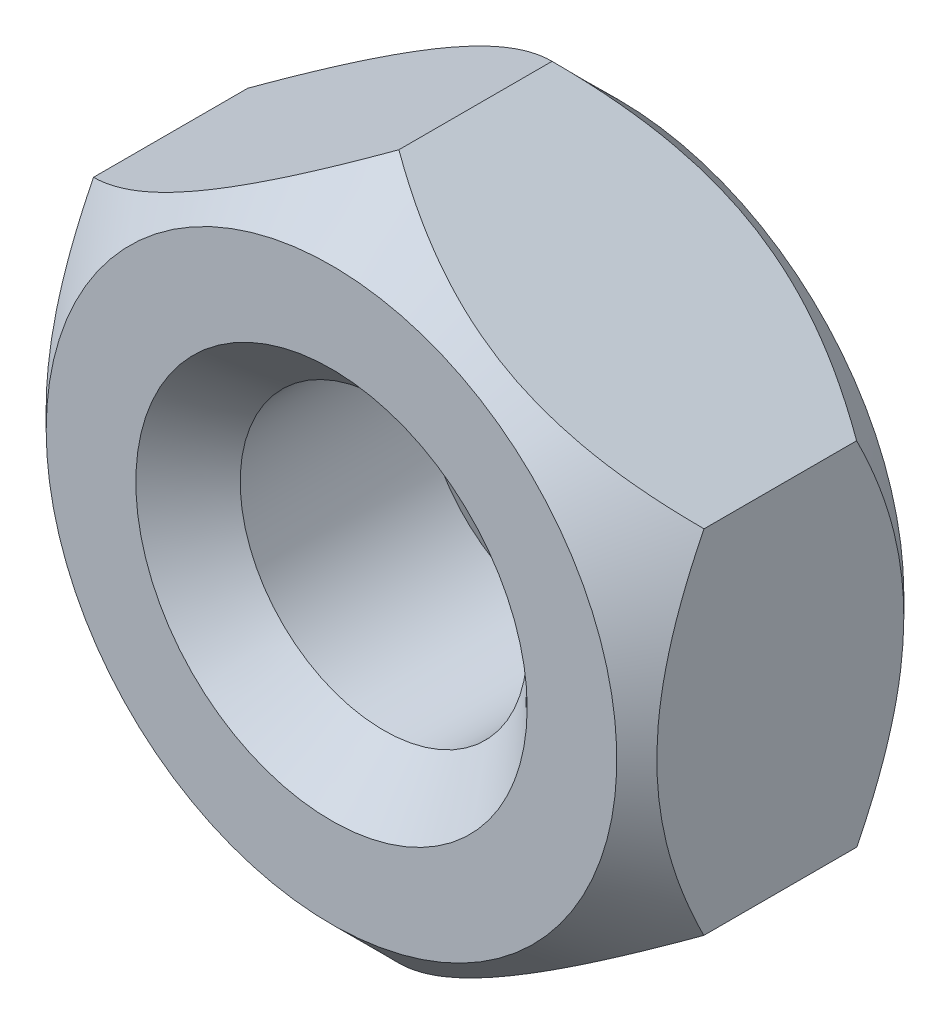
ISO-10303-21;
HEADER;
FILE_DESCRIPTION(('STEP AP214'),'2;1');
FILE_NAME('part.step','',(''),(''),'','','');
FILE_SCHEMA(('AUTOMOTIVE_DESIGN { 1 0 10303 214 1 1 1 1 }'));
ENDSEC;
DATA;
#1=APPLICATION_CONTEXT('core data for automotive mechanical design processes');
#2=APPLICATION_PROTOCOL_DEFINITION('international standard','automotive_design',2000,#1);
#3=PRODUCT_CONTEXT('',#1,'mechanical');
#4=PRODUCT('Part','Part','',(#3));
#5=PRODUCT_RELATED_PRODUCT_CATEGORY('part','',(#4));
#6=PRODUCT_DEFINITION_FORMATION('','',#4);
#7=PRODUCT_DEFINITION_CONTEXT('part definition',#1,'design');
#8=PRODUCT_DEFINITION('design','',#6,#7);
#9=PRODUCT_DEFINITION_SHAPE('','',#8);
#10=(LENGTH_UNIT() NAMED_UNIT(*) SI_UNIT(.MILLI.,.METRE.));
#11=(NAMED_UNIT(*) PLANE_ANGLE_UNIT() SI_UNIT($,.RADIAN.));
#12=(NAMED_UNIT(*) SI_UNIT($,.STERADIAN.) SOLID_ANGLE_UNIT());
#13=UNCERTAINTY_MEASURE_WITH_UNIT(LENGTH_MEASURE(1.E-05),#10,'distance_accuracy_value','');
#14=(GEOMETRIC_REPRESENTATION_CONTEXT(3) GLOBAL_UNCERTAINTY_ASSIGNED_CONTEXT((#13)) GLOBAL_UNIT_ASSIGNED_CONTEXT((#10,
#11,#12)) REPRESENTATION_CONTEXT('',''));
#15=CARTESIAN_POINT('',(0.,0.,0.));
#16=DIRECTION('',(0.,0.,1.));
#17=DIRECTION('',(1.,0.,0.));
#18=AXIS2_PLACEMENT_3D('',#15,#16,#17);
#19=CARTESIAN_POINT('',(-3.50533125615029,2.0238039443372,0.));
#20=DIRECTION('',(0.,0.,-1.));
#21=DIRECTION('',(-1.,0.,0.));
#22=AXIS2_PLACEMENT_3D('',#19,#20,#21);
#23=PLANE('',#22);
#24=CARTESIAN_POINT('',(3.5,2.02141534193803,-5.6843418860808E-11));
#25=DIRECTION('',(0.,0.,-1.));
#26=DIRECTION('',(-1.,0.,0.));
#27=AXIS2_PLACEMENT_3D('',#24,#25,#26);
#28=CIRCLE('',#27,2.25000000002956);
#29=CARTESIAN_POINT('',(1.24999999997044,2.02141534193803,-5.6843418860808E-11));
#30=VERTEX_POINT('',#29);
#31=EDGE_CURVE('E93',#30,#30,#28,.F.);
#32=ORIENTED_EDGE('',*,*,#31,.T.);
#33=EDGE_LOOP('',(#32));
#34=FACE_BOUND('',#33,.T.);
#35=CARTESIAN_POINT('',(3.5,2.02141534193803,5.6843418860808E-11));
#36=DIRECTION('',(0.,0.,1.));
#37=DIRECTION('',(0.,-1.,0.));
#38=AXIS2_PLACEMENT_3D('',#35,#36,#37);
#39=CIRCLE('',#38,3.28068244718088);
#40=CARTESIAN_POINT('',(0.219317552832081,2.02141534193803,5.6843418860808E-11));
#41=VERTEX_POINT('',#40);
#42=CARTESIAN_POINT('',(6.78068244719634,2.02141534193803,5.6843418860808E-11));
#43=VERTEX_POINT('',#42);
#44=EDGE_CURVE('E77',#41,#43,#39,.T.);
#45=ORIENTED_EDGE('',*,*,#44,.F.);
#46=CARTESIAN_POINT('',(3.5,2.02141534193803,5.6843418860808E-11));
#47=DIRECTION('',(0.,0.,1.));
#48=DIRECTION('',(1.,0.,0.));
#49=AXIS2_PLACEMENT_3D('',#46,#47,#48);
#50=CIRCLE('',#49,3.28068244718088);
#51=EDGE_CURVE('E19',#43,#41,#50,.T.);
#52=ORIENTED_EDGE('',*,*,#51,.F.);
#53=EDGE_LOOP('',(#45,#52));
#54=FACE_BOUND('',#53,.T.);
#55=ADVANCED_FACE('F16',(#34,#54),#23,.T.);
#56=CARTESIAN_POINT('',(3.5,2.02141534193803,0.777373210667065));
#57=DIRECTION('',(0.,0.,1.));
#58=DIRECTION('',(1.,0.,0.));
#59=AXIS2_PLACEMENT_3D('',#56,#57,#58);
#60=CONICAL_SURFACE('',#59,4.0580556577911,0.785398163397448);
#61=CARTESIAN_POINT('',(3.50533125616209,6.07141183300475,0.769317552869173));
#62=CARTESIAN_POINT('',(3.62565844455544,6.00194089839502,0.700070311400391));
#63=CARTESIAN_POINT('',(3.74799438359712,5.93131021105774,0.634905351474907));
#64=CARTESIAN_POINT('',(3.99743128834801,5.78729774695399,0.515617597066178));
#65=CARTESIAN_POINT('',(4.12455568214029,5.71390244397744,0.461560709317952));
#66=CARTESIAN_POINT('',(4.38088172353867,5.56591253497577,0.368980520787429));
#67=CARTESIAN_POINT('',(4.51001853607918,5.49135536149322,0.330224651609249));
#68=CARTESIAN_POINT('',(4.77111858326524,5.34060917896493,0.270527774278134));
#69=CARTESIAN_POINT('',(4.90307396660156,5.26442470287468,0.249542582119648));
#70=CARTESIAN_POINT('',(5.13077153319626,5.1329634515074,0.230598139138308));
#71=CARTESIAN_POINT('',(5.226224053325,5.07785391331625,0.227812010561135));
#72=CARTESIAN_POINT('',(5.41697073795688,4.967726263597,0.232636947197373));
#73=CARTESIAN_POINT('',(5.51226483561401,4.91270819066247,0.240251639229996));
#74=CARTESIAN_POINT('',(5.70195087258167,4.80319290615768,0.265443809936975));
#75=CARTESIAN_POINT('',(5.79634165017556,4.74869636530483,0.283032719850631));
#76=CARTESIAN_POINT('',(5.98350088999002,4.64063992781663,0.327214264638234));
#77=CARTESIAN_POINT('',(6.07626947527162,4.58707996013195,0.3538062133896));
#78=CARTESIAN_POINT('',(6.24094259007453,4.4920058929722,0.408501357907497));
#79=CARTESIAN_POINT('',(6.31321203126309,4.4502811116478,0.435167399984728));
#80=CARTESIAN_POINT('',(6.456453784466,4.3675804468769,0.49279100488819));
#81=CARTESIAN_POINT('',(6.52742605760965,4.32660458587241,0.523748696079357));
#82=CARTESIAN_POINT('',(6.66784724619505,4.24553237484271,0.589261084504627));
#83=CARTESIAN_POINT('',(6.73730020670826,4.20543368939439,0.623804317051651));
#84=CARTESIAN_POINT('',(6.8749206049286,4.12597851543589,0.696035994504792));
#85=CARTESIAN_POINT('',(6.94308879857329,4.08662159048496,0.733722514315395));
#86=CARTESIAN_POINT('',(7.01066251228879,4.04760788868117,0.772736789972875));
#87=B_SPLINE_CURVE_WITH_KNOTS('',3,(#61,#62,#63,#64,#65,#66,#67,#68,#69,#70,#71,#72,#73,#74,#75,
#76,#77,#78,#79,#80,#81,#82,#83,#84,#85,#86),.UNSPECIFIED.,.F.,.F.,(4,2,2,2,2,2,2,2,2,2,2,2,4),
(0.,0.466045816564918,0.934781662279878,1.39609003408941,1.85624803881621,2.18654321992817,
2.51695360606354,2.84774343606938,3.17850806221838,3.44120469459729,3.70390918603311,
3.9657981519982,4.2275278864309),.UNSPECIFIED.);
#88=CARTESIAN_POINT('',(3.5053312561562,6.07141183300815,0.769317552872569));
#89=VERTEX_POINT('',#88);
#90=CARTESIAN_POINT('',(7.0106625122947,4.04760788867095,0.772736789972878));
#91=VERTEX_POINT('',#90);
#92=EDGE_CURVE('E99',#89,#91,#87,.T.);
#93=ORIENTED_EDGE('',*,*,#92,.T.);
#94=CARTESIAN_POINT('',(7.0106625123006,4.04760788866072,0.772736789972881));
#95=CARTESIAN_POINT('',(7.0106625123006,3.90743052741894,0.702731850201684));
#96=CARTESIAN_POINT('',(7.0106625123006,3.76488442163311,0.636864305319971));
#97=CARTESIAN_POINT('',(7.0106625123006,3.47411141205051,0.516333289120519));
#98=CARTESIAN_POINT('',(7.0106625123006,3.32585414896188,0.461743725547648));
#99=CARTESIAN_POINT('',(7.0106625123006,3.02887437907535,0.36903961905229));
#100=CARTESIAN_POINT('',(7.0106625123006,2.88029048343505,0.330492572666764));
#101=CARTESIAN_POINT('',(7.0106625123006,2.57993729900295,0.271104129006165));
#102=CARTESIAN_POINT('',(7.0106625123006,2.42817920255533,0.250208684133935));
#103=CARTESIAN_POINT('',(7.0106625123006,2.23356062827331,0.236128515860647));
#104=CARTESIAN_POINT('',(7.0106625123006,2.19126694811868,0.233830949556362));
#105=CARTESIAN_POINT('',(7.0106625123006,2.10645679140461,0.23075431280353));
#106=CARTESIAN_POINT('',(7.0106625123006,2.0639400956256,0.22998128918285));
#107=CARTESIAN_POINT('',(7.0106625123006,2.02141534193803,0.229980065176564));
#108=B_SPLINE_CURVE_WITH_KNOTS('',3,(#94,#95,#96,#97,#98,#99,#100,#101,#102,#103,#104,#105,#106,
#107),.UNSPECIFIED.,.F.,.F.,(4,2,2,2,2,2,4),(0.,0.470403080076154,0.943797358138805,
1.40344051517802,1.86167113222725,1.98871953389967,2.11627084507855),.UNSPECIFIED.);
#109=CARTESIAN_POINT('',(7.01066251230046,2.02141534193803,0.229980065182354));
#110=VERTEX_POINT('',#109);
#111=EDGE_CURVE('E124',#91,#110,#108,.T.);
#112=ORIENTED_EDGE('',*,*,#111,.T.);
#113=DIRECTION('',(-0.707106781186546,0.,-0.707106781186549));
#114=VECTOR('',#113,1.);
#115=CARTESIAN_POINT('',(499006.780682445,2.02141534187692,499000.));
#116=LINE('',#115,#114);
#117=EDGE_CURVE('E87',#43,#110,#116,.F.);
#118=ORIENTED_EDGE('',*,*,#117,.F.);
#119=ORIENTED_EDGE('',*,*,#51,.T.);
#120=DIRECTION('',(0.707106781186546,0.,-0.707106781186549));
#121=VECTOR('',#120,1.);
#122=CARTESIAN_POINT('',(-498999.780682445,2.02141534193803,499000.));
#123=LINE('',#122,#121);
#124=CARTESIAN_POINT('',(0.,2.02141534193803,0.219317552875964));
#125=VERTEX_POINT('',#124);
#126=EDGE_CURVE('E84',#125,#41,#123,.T.);
#127=ORIENTED_EDGE('',*,*,#126,.F.);
#128=CARTESIAN_POINT('',(0.,2.02141534193803,0.219317552875964));
#129=CARTESIAN_POINT('',(0.,2.07517216704385,0.219313247736622));
#130=CARTESIAN_POINT('',(0.,2.12892095618338,0.220556658354902));
#131=CARTESIAN_POINT('',(0.,2.23629736133707,0.225498356646063));
#132=CARTESIAN_POINT('',(0.,2.28992499508591,0.229196258040444));
#133=CARTESIAN_POINT('',(0.,2.4502821749131,0.243892074095429));
#134=CARTESIAN_POINT('',(0.,2.55669942948939,0.258492421746994));
#135=CARTESIAN_POINT('',(0.,2.76630501858256,0.2962401392555));
#136=CARTESIAN_POINT('',(0.,2.86951784561026,0.319255110380186));
#137=CARTESIAN_POINT('',(0.,3.07398525944271,0.372831287380979));
#138=CARTESIAN_POINT('',(0.,3.17523921825101,0.403394871422896));
#139=CARTESIAN_POINT('',(0.,3.34131224720704,0.459407516719574));
#140=CARTESIAN_POINT('',(0.,3.40675767132223,0.483035087773453));
#141=CARTESIAN_POINT('',(0.,3.53668316816687,0.532772265829584));
#142=CARTESIAN_POINT('',(0.,3.60116343849823,0.558881356501679));
#143=CARTESIAN_POINT('',(0.,3.72985052884107,0.613585197994553));
#144=CARTESIAN_POINT('',(0.,3.79404748115815,0.64220303532836));
#145=CARTESIAN_POINT('',(0.,3.92151318655159,0.701427043944789));
#146=CARTESIAN_POINT('',(0.,3.98478200868403,0.732033066370369));
#147=CARTESIAN_POINT('',(0.,4.04760788866073,0.763505510475685));
#148=B_SPLINE_CURVE_WITH_KNOTS('',3,(#128,#129,#130,#131,#132,#133,#134,#135,#136,#137,#138,
#139,#140,#141,#142,#143,#144,#145,#146,#147),.UNSPECIFIED.,.F.,.F.,(4,2,2,2,2,2,2,2,2,4),(0.,
0.161240731690053,0.322456093936699,0.644248934896944,0.961182357686911,1.27821575696714,
1.48690773929255,1.69555639371211,1.90638139898394,2.11719063776766),.UNSPECIFIED.);
#149=CARTESIAN_POINT('',(5.89509400087505E-12,4.04760788867778,0.763505510479126));
#150=VERTEX_POINT('',#149);
#151=EDGE_CURVE('E133',#125,#150,#148,.T.);
#152=ORIENTED_EDGE('',*,*,#151,.T.);
#153=CARTESIAN_POINT('',(1.17901995906768E-11,4.04760788868118,0.763505510475729));
#154=CARTESIAN_POINT('',(0.120183243840653,4.11699571685786,0.694323738578042));
#155=CARTESIAN_POINT('',(0.242373272211507,4.18754216263006,0.629218894925807));
#156=CARTESIAN_POINT('',(0.491514833037274,4.33138410983914,0.510038776573573));
#157=CARTESIAN_POINT('',(0.61848979635648,4.40469313909182,0.456029398084715));
#158=CARTESIAN_POINT('',(0.874507577000446,4.55250507366395,0.36353239615745));
#159=CARTESIAN_POINT('',(1.00348531817609,4.62697040725117,0.324811412313919));
#160=CARTESIAN_POINT('',(1.26426535263423,4.77753183034486,0.265166573727319));
#161=CARTESIAN_POINT('',(1.396059792248,4.85362338553357,0.244198538311983));
#162=CARTESIAN_POINT('',(1.6234517483991,4.98490819262896,0.225270163323934));
#163=CARTESIAN_POINT('',(1.71875954683597,5.03993417571236,0.22248430929004));
#164=CARTESIAN_POINT('',(1.90921734549211,5.14989503703574,0.227294124155477));
#165=CARTESIAN_POINT('',(2.00436727909645,5.20482987681559,0.234893413525336));
#166=CARTESIAN_POINT('',(2.19376950556839,5.31418130325427,0.260040385398208));
#167=CARTESIAN_POINT('',(2.2880206082497,5.36859720275875,0.277599783002124));
#168=CARTESIAN_POINT('',(2.47490301781702,5.47649381222924,0.321709614727266));
#169=CARTESIAN_POINT('',(2.56753444625601,5.52997459237392,0.348259371069725));
#170=CARTESIAN_POINT('',(2.73239415582797,5.62515639007381,0.403011864580751));
#171=CARTESIAN_POINT('',(2.80497938549175,5.66706349195938,0.429808484978082));
#172=CARTESIAN_POINT('',(2.94883936762295,5.75012109136845,0.487734504560677));
#173=CARTESIAN_POINT('',(3.02011407216378,5.7912715612215,0.518864061848415));
#174=CARTESIAN_POINT('',(3.1611247380612,5.87268410713599,0.584750881226159));
#175=CARTESIAN_POINT('',(3.23086480754947,5.91294855502835,0.61949651811324));
#176=CARTESIAN_POINT('',(3.36904637354729,5.99272771935423,0.692156548626928));
#177=CARTESIAN_POINT('',(3.43748865270112,6.03224288764764,0.730068952772703));
#178=CARTESIAN_POINT('',(3.50533125613849,6.07141183300473,0.769317552869124));
#179=B_SPLINE_CURVE_WITH_KNOTS('',3,(#153,#154,#155,#156,#157,#158,#159,#160,#161,#162,#163,
#164,#165,#166,#167,#168,#169,#170,#171,#172,#173,#174,#175,#176,#177,#178),.UNSPECIFIED.,.F.,
.F.,(4,2,2,2,2,2,2,2,2,2,2,2,4),(0.,0.465511854484521,0.933713192210015,1.39446271354642,
1.8540621970008,2.18385691527792,2.51376663598254,2.84406520426088,3.17433887703276,
3.43819456629286,3.70205988578287,3.96510168752075,4.22797946193079),.UNSPECIFIED.);
#180=EDGE_CURVE('E106',#150,#89,#179,.T.);
#181=ORIENTED_EDGE('',*,*,#180,.T.);
#182=EDGE_LOOP('',(#93,#112,#118,#119,#127,#152,#181));
#183=FACE_BOUND('',#182,.T.);
#184=ADVANCED_FACE('F82',(#183),#60,.T.);
#185=CARTESIAN_POINT('',(3.5,2.02141534193803,0.774973015495561));
#186=DIRECTION('',(0.,0.,1.));
#187=DIRECTION('',(0.,-1.,0.));
#188=AXIS2_PLACEMENT_3D('',#185,#186,#187);
#189=CONICAL_SURFACE('',#188,4.05565546256275,0.785398163360774);
#190=CARTESIAN_POINT('',(-1.12865829015158E-11,3.34919453490439E-11,0.761114181219393));
#191=CARTESIAN_POINT('',(-4.05954886502679E-12,0.139835517174464,0.691244563064172));
#192=CARTESIAN_POINT('',(-1.08968841782847E-12,0.282034864947546,0.625501062021797));
#193=CARTESIAN_POINT('',(1.09662984611318E-12,0.572105438712708,0.505191243612707));
#194=CARTESIAN_POINT('',(2.89057587004739E-13,0.720007024960852,0.450698793820084));
#195=CARTESIAN_POINT('',(-2.8065223695477E-13,1.0162744947255,0.358156657567183));
#196=CARTESIAN_POINT('',(0.,1.16450181799025,0.319674917327325));
#197=CARTESIAN_POINT('',(0.,1.46413823014686,0.260384020169641));
#198=CARTESIAN_POINT('',(0.,1.6155361215715,0.239520833005765));
#199=CARTESIAN_POINT('',(0.,1.80970684632346,0.225459358154075));
#200=CARTESIAN_POINT('',(0.,1.85191324873337,0.223164287049851));
#201=CARTESIAN_POINT('',(0.,1.93654871801242,0.220090970917725));
#202=CARTESIAN_POINT('',(0.,1.97897800436481,0.219318774061527));
#203=CARTESIAN_POINT('',(0.,2.02141534193803,0.219317552892051));
#204=B_SPLINE_CURVE_WITH_KNOTS('',3,(#190,#191,#192,#193,#194,#195,#196,#197,#198,#199,#200,
#201,#202,#203),.UNSPECIFIED.,.F.,.F.,(4,2,2,2,2,2,4),(0.,0.469303944373667,0.941597403566293,
1.40015729604265,1.85730577762646,1.98409232167152,2.111381398846),.UNSPECIFIED.);
#205=CARTESIAN_POINT('',(0.,1.79838506258977E-11,0.761114181233337));
#206=VERTEX_POINT('',#205);
#207=EDGE_CURVE('E92',#206,#125,#204,.T.);
#208=ORIENTED_EDGE('',*,*,#207,.T.);
#209=ORIENTED_EDGE('',*,*,#126,.T.);
#210=ORIENTED_EDGE('',*,*,#44,.T.);
#211=ORIENTED_EDGE('',*,*,#117,.T.);
#212=CARTESIAN_POINT('',(7.0106625123006,2.02141534193803,0.229980065193433));
#213=CARTESIAN_POINT('',(7.0106625123006,1.96749593402579,0.229975747635895));
#214=CARTESIAN_POINT('',(7.0106625123006,1.9135845875881,0.231222891039762));
#215=CARTESIAN_POINT('',(7.0106625123006,1.80588342443986,0.236179426487025));
#216=CARTESIAN_POINT('',(7.0106625123006,1.75209358995221,0.239888431319063));
#217=CARTESIAN_POINT('',(7.0106625123006,1.59125088902425,0.254628423599887));
#218=CARTESIAN_POINT('',(7.0106625123006,1.48451124424622,0.269272710108766));
#219=CARTESIAN_POINT('',(7.0106625123006,1.27426655188548,0.307134810496878));
#220=CARTESIAN_POINT('',(7.0106625123006,1.17073700015669,0.330220163289685));
#221=CARTESIAN_POINT('',(7.0106625123006,0.965642448444564,0.383960379562392));
#222=CARTESIAN_POINT('',(7.0106625123006,0.864078070486434,0.414617598785406));
#223=CARTESIAN_POINT('',(7.0106625123006,0.698453540128128,0.470478987597922));
#224=CARTESIAN_POINT('',(7.0106625123006,0.633751142357683,0.493815944687274));
#225=CARTESIAN_POINT('',(7.0106625123006,0.505287279966014,0.542911987510028));
#226=CARTESIAN_POINT('',(7.0106625123006,0.441525617585886,0.568670555537315));
#227=CARTESIAN_POINT('',(7.0106625123006,0.314270963717655,0.622615573565625));
#228=CARTESIAN_POINT('',(7.0106625123006,0.250787425406525,0.650824203508053));
#229=CARTESIAN_POINT('',(7.0106625123006,0.124725046037525,0.709188810891753));
#230=CARTESIAN_POINT('',(7.0106625123006,0.0621461523281085,0.739344674438371));
#231=CARTESIAN_POINT('',(7.0106625123006,3.54777653010927E-11,0.77035090996025));
#232=B_SPLINE_CURVE_WITH_KNOTS('',3,(#212,#213,#214,#215,#216,#217,#218,#219,#220,#221,#222,
#223,#224,#225,#226,#227,#228,#229,#230,#231),.UNSPECIFIED.,.F.,.F.,(4,2,2,2,2,2,2,2,2,4),(0.,
0.161728388321317,0.323431345384156,0.646198924658982,0.964104822616489,1.28210975165101,
1.48841122103438,1.69466868594813,1.90304033446862,2.11139980624918),.UNSPECIFIED.);
#233=CARTESIAN_POINT('',(7.01066251228489,-9.08943630769627E-12,0.770350909968876));
#234=VERTEX_POINT('',#233);
#235=EDGE_CURVE('E250',#110,#234,#232,.T.);
#236=ORIENTED_EDGE('',*,*,#235,.T.);
#237=CARTESIAN_POINT('',(7.01066251227704,-2.67603056335835E-11,0.770350909954798));
#238=CARTESIAN_POINT('',(6.95024374615784,-0.0348827909014888,0.735403804785091));
#239=CARTESIAN_POINT('',(6.88936200729229,-0.070032879220731,0.701526134712106));
#240=CARTESIAN_POINT('',(6.76657653209422,-0.14092310637626,0.636236698585315));
#241=CARTESIAN_POINT('',(6.70467225737948,-0.176663556047667,0.604826285142013));
#242=CARTESIAN_POINT('',(6.51670126262856,-0.285188660468348,0.51451615993448));
#243=CARTESIAN_POINT('',(6.38903297506293,-0.358897980660657,0.459925880761344));
#244=CARTESIAN_POINT('',(6.13160857127006,-0.507522029485957,0.366416543880462));
#245=CARTESIAN_POINT('',(6.00191754286018,-0.582399179650063,0.327262987584429));
#246=CARTESIAN_POINT('',(5.73965795314625,-0.733814824369089,0.266922235784187));
#247=CARTESIAN_POINT('',(5.60709752922291,-0.810348620805068,0.245689699868072));
#248=CARTESIAN_POINT('',(5.37886540221854,-0.942118500768739,0.226542889883833));
#249=CARTESIAN_POINT('',(5.2834913859477,-0.99718271473641,0.223694910331497));
#250=CARTESIAN_POINT('',(5.09289565436677,-1.10722321167106,0.228392084398604));
#251=CARTESIAN_POINT('',(4.9976740045451,-1.16219945682828,0.235940899655505));
#252=CARTESIAN_POINT('',(4.80813704365539,-1.27162867221934,0.261000304161024));
#253=CARTESIAN_POINT('',(4.71382279962869,-1.32608102639657,0.278521438405759));
#254=CARTESIAN_POINT('',(4.52681316755964,-1.43405108781268,0.322568021197317));
#255=CARTESIAN_POINT('',(4.43411765379621,-1.48756886763667,0.349092767165527));
#256=CARTESIAN_POINT('',(4.27001407512159,-1.58231411295945,0.403522709692482));
#257=CARTESIAN_POINT('',(4.19823396040101,-1.62375638151583,0.429960874030879));
#258=CARTESIAN_POINT('',(4.0559543226548,-1.70590156866881,0.487081609594229));
#259=CARTESIAN_POINT('',(3.98545483020487,-1.74660446961251,0.517764282009302));
#260=CARTESIAN_POINT('',(3.8459549831656,-1.82714474385254,0.582693818597766));
#261=CARTESIAN_POINT('',(3.77695075639041,-1.86698435275642,0.616929681751147));
#262=CARTESIAN_POINT('',(3.64021250088795,-1.94593022137929,0.688519182901318));
#263=CARTESIAN_POINT('',(3.57247774193995,-1.98503690269141,0.725870956673455));
#264=CARTESIAN_POINT('',(3.50533125618069,-2.02380394431966,0.764540352260112));
#265=B_SPLINE_CURVE_WITH_KNOTS('',3,(#237,#238,#239,#240,#241,#242,#243,#244,#245,#246,#247,
#248,#249,#250,#251,#252,#253,#254,#255,#256,#257,#258,#259,#260,#261,#262,#263,#264),
.UNSPECIFIED.,.F.,.F.,(4,2,2,2,2,2,2,2,2,2,2,2,2,4),(0.,0.234069526997775,0.468266493789788,
0.939209740516026,1.40269448093258,1.86500305375885,2.19503264322842,2.52517849523809,
2.85567410260158,3.18614392633586,3.44702011599867,3.7079025260864,3.96800004096132,
4.22794304253348),.UNSPECIFIED.);
#266=CARTESIAN_POINT('',(3.50533125613466,-2.02380394432817,0.764540352268571));
#267=VERTEX_POINT('',#266);
#268=EDGE_CURVE('E215',#234,#267,#265,.T.);
#269=ORIENTED_EDGE('',*,*,#268,.T.);
#270=CARTESIAN_POINT('',(3.50533125611551,-2.0238039443302,0.764540352254554));
#271=CARTESIAN_POINT('',(3.44498429151726,-1.98896260806636,0.729625784431781));
#272=CARTESIAN_POINT('',(3.38417480452018,-1.95385423437582,0.695779336696881));
#273=CARTESIAN_POINT('',(3.26153472690867,-1.88304795255073,0.630549464801933));
#274=CARTESIAN_POINT('',(3.19970359798515,-1.8473497336233,0.599167392701449));
#275=CARTESIAN_POINT('',(3.01195344522277,-1.73895213238693,0.508937547996211));
#276=CARTESIAN_POINT('',(2.88443413675667,-1.66532882531647,0.454394495430514));
#277=CARTESIAN_POINT('',(2.62731715807522,-1.51688226846102,0.360967989818018));
#278=CARTESIAN_POINT('',(2.49778482234662,-1.44209673955953,0.321849223814285));
#279=CARTESIAN_POINT('',(2.23584447403645,-1.29086540895116,0.261560476596246));
#280=CARTESIAN_POINT('',(2.10344460165598,-1.21442430699157,0.24034515638517));
#281=CARTESIAN_POINT('',(1.87551756817925,-1.08283057285816,0.221214739212152));
#282=CARTESIAN_POINT('',(1.78028815295852,-1.02784984434571,0.218367217557394));
#283=CARTESIAN_POINT('',(1.58998108235151,-0.917976005902069,0.223049658177794));
#284=CARTESIAN_POINT('',(1.49490349222853,-0.863082933650664,0.230583275792549));
#285=CARTESIAN_POINT('',(1.3056501504755,-0.753817465844512,0.255597899276152));
#286=CARTESIAN_POINT('',(1.21147549427487,-0.699445702736237,0.273089734046013));
#287=CARTESIAN_POINT('',(1.02474253057068,-0.591635375875048,0.317065028267817));
#288=CARTESIAN_POINT('',(0.932184098876607,-0.538196740420703,0.343547793632406));
#289=CARTESIAN_POINT('',(0.767894616330557,-0.443344163447716,0.398035000146353));
#290=CARTESIAN_POINT('',(0.695799418296227,-0.401719981455316,0.424603243047948));
#291=CARTESIAN_POINT('',(0.552902850691441,-0.319218609682418,0.482025120402198));
#292=CARTESIAN_POINT('',(0.482101520453062,-0.278341442610306,0.512878884885335));
#293=CARTESIAN_POINT('',(0.342013199848056,-0.197461412998682,0.578181199031685));
#294=CARTESIAN_POINT('',(0.272722276929567,-0.157456279999295,0.612618593704765));
#295=CARTESIAN_POINT('',(0.135423590398134,-0.0781868463709893,0.684634649179703));
#296=CARTESIAN_POINT('',(0.067415070479669,-0.0389221090888749,0.722211382690729));
#297=CARTESIAN_POINT('',(3.03405124982464E-11,-1.75168655577607E-11,0.761114181224818));
#298=B_SPLINE_CURVE_WITH_KNOTS('',3,(#270,#271,#272,#273,#274,#275,#276,#277,#278,#279,#280,
#281,#282,#283,#284,#285,#286,#287,#288,#289,#290,#291,#292,#293,#294,#295,#296,#297),
.UNSPECIFIED.,.F.,.F.,(4,2,2,2,2,2,2,2,2,2,2,2,2,4),(0.,0.233803440822608,0.46773427257937,
0.938144916859756,1.40107216874169,1.8628235472735,2.19235308101075,2.52199867620979,
2.85200342572833,3.18198270512936,3.44401517786553,3.70605560287873,3.96730346414301,
4.2283921033735),.UNSPECIFIED.);
#299=EDGE_CURVE('E141',#267,#206,#298,.T.);
#300=ORIENTED_EDGE('',*,*,#299,.T.);
#301=EDGE_LOOP('',(#208,#209,#210,#211,#236,#269,#300));
#302=FACE_BOUND('',#301,.T.);
#303=ADVANCED_FACE('F90',(#302),#189,.T.);
#304=CARTESIAN_POINT('',(3.5,2.02141534193803,5.6843418860808E-11));
#305=DIRECTION('',(0.,0.,-1.));
#306=DIRECTION('',(-1.,0.,0.));
#307=AXIS2_PLACEMENT_3D('',#304,#305,#306);
#308=CONICAL_SURFACE('',#307,2.24999999991587,0.785398163397448);
#309=CARTESIAN_POINT('',(3.5,2.02141534193803,0.600000000000002));
#310=DIRECTION('',(0.,0.,1.));
#311=DIRECTION('',(1.,0.,0.));
#312=AXIS2_PLACEMENT_3D('',#309,#310,#311);
#313=CIRCLE('',#312,1.65);
#314=CARTESIAN_POINT('',(5.15,2.02141534193803,0.600000000000002));
#315=VERTEX_POINT('',#314);
#316=EDGE_CURVE('E238',#315,#315,#313,.T.);
#317=ORIENTED_EDGE('',*,*,#316,.T.);
#318=EDGE_LOOP('',(#317));
#319=FACE_BOUND('',#318,.T.);
#320=ORIENTED_EDGE('',*,*,#31,.F.);
#321=EDGE_LOOP('',(#320));
#322=FACE_BOUND('',#321,.T.);
#323=ADVANCED_FACE('F342',(#319,#322),#308,.F.);
#324=CARTESIAN_POINT('',(3.50533125615031,6.07141183301156,3.3));
#325=DIRECTION('',(-0.500000000000004,-0.866025403784436,0.));
#326=DIRECTION('',(0.866025403784436,-0.500000000000004,0.));
#327=AXIS2_PLACEMENT_3D('',#324,#325,#326);
#328=PLANE('',#327);
#329=ORIENTED_EDGE('',*,*,#92,.F.);
#330=DIRECTION('',(0.,0.,1.));
#331=VECTOR('',#330,1.);
#332=CARTESIAN_POINT('',(3.50533125615031,6.07141183301156,3.3));
#333=LINE('',#332,#331);
#334=CARTESIAN_POINT('',(3.50533128675126,6.07141181534409,2.53068246471865));
#335=VERTEX_POINT('',#334);
#336=EDGE_CURVE('E235',#89,#335,#333,.T.);
#337=ORIENTED_EDGE('',*,*,#336,.T.);
#338=CARTESIAN_POINT('',(7.01066250337673,4.04760785845136,2.52726318949876));
#339=CARTESIAN_POINT('',(6.95029589199233,4.08246056011673,2.56211855890266));
#340=CARTESIAN_POINT('',(6.88946728428775,4.1175799826185,2.59590486687922));
#341=CARTESIAN_POINT('',(6.76679086454145,4.18840725373133,2.66101341037217));
#342=CARTESIAN_POINT('',(6.70494251769791,4.22411541110397,2.69233429974792));
#343=CARTESIAN_POINT('',(6.51714984390367,4.33253755811012,2.78237728801398));
#344=CARTESIAN_POINT('',(6.3896091623763,4.40617320676684,2.83679523342313));
#345=CARTESIAN_POINT('',(6.13245215207874,4.55464287721045,2.92999492257168));
#346=CARTESIAN_POINT('',(6.00290049869535,4.62943955868229,2.96901022661556));
#347=CARTESIAN_POINT('',(5.74093508015267,4.780685363249,3.0291275469094));
#348=CARTESIAN_POINT('',(5.6085293488325,4.85712984800314,3.05027444988905));
#349=CARTESIAN_POINT('',(5.38035627422766,4.98886563411537,3.06935259638365));
#350=CARTESIAN_POINT('',(5.28488326536304,5.04398700146316,3.07217734914261));
#351=CARTESIAN_POINT('',(5.09409195806821,5.15414041407382,3.06742484433929));
#352=CARTESIAN_POINT('',(4.99877372569619,5.20917242119799,3.05984393567747));
#353=CARTESIAN_POINT('',(4.80904416490415,5.31871283419854,3.03471304704048));
#354=CARTESIAN_POINT('',(4.71463392605882,5.37322061100867,3.01715231879883));
#355=CARTESIAN_POINT('',(4.52743479464286,5.48130007992267,2.97302070085275));
#356=CARTESIAN_POINT('',(4.43464577664326,5.53487184444299,2.94645051145806));
#357=CARTESIAN_POINT('',(4.27041251538487,5.62969196204064,2.89194694154182));
#358=CARTESIAN_POINT('',(4.19859518860417,5.67115571498988,2.86548384620095));
#359=CARTESIAN_POINT('',(4.05624114663452,5.75334385944123,2.80831469851072));
#360=CARTESIAN_POINT('',(3.98570446104734,5.79406823385276,2.77760854822492));
#361=CARTESIAN_POINT('',(3.84613221963587,5.87465030500309,2.71263401396781));
#362=CARTESIAN_POINT('',(3.77709275514695,5.91451025841047,2.67837673283068));
#363=CARTESIAN_POINT('',(3.6402837226039,5.99349699017676,2.60674505362177));
#364=CARTESIAN_POINT('',(3.57251342685475,6.03262418867059,2.56937251318726));
#365=CARTESIAN_POINT('',(3.50533131735221,6.07141179767662,2.53068248234582));
#366=B_SPLINE_CURVE_WITH_KNOTS('',3,(#338,#339,#340,#341,#342,#343,#344,#345,#346,#347,#348,
#349,#350,#351,#352,#353,#354,#355,#356,#357,#358,#359,#360,#361,#362,#363,#364,#365),
.UNSPECIFIED.,.F.,.F.,(4,2,2,2,2,2,2,2,2,2,2,2,2,4),(0.,0.233784842436765,0.467696460592695,
0.938047389483322,1.40096362318268,1.86271349068577,2.19308355690318,2.5235695717693,
2.8544121964706,3.18522911050912,3.44625100979773,3.7072789348932,3.9675140404494,
4.227595062255),.UNSPECIFIED.);
#367=CARTESIAN_POINT('',(7.0106625123006,4.04760785327849,2.52726322768116));
#368=VERTEX_POINT('',#367);
#369=EDGE_CURVE('E240',#368,#335,#366,.T.);
#370=ORIENTED_EDGE('',*,*,#369,.F.);
#371=DIRECTION('',(0.,0.,1.));
#372=VECTOR('',#371,1.);
#373=CARTESIAN_POINT('',(7.0106625123006,4.04760788867435,3.3));
#374=LINE('',#373,#372);
#375=EDGE_CURVE('E225',#368,#91,#374,.F.);
#376=ORIENTED_EDGE('',*,*,#375,.T.);
#377=EDGE_LOOP('',(#329,#337,#370,#376));
#378=FACE_BOUND('',#377,.T.);
#379=ADVANCED_FACE('F113',(#378),#328,.F.);
#380=CARTESIAN_POINT('',(0.,4.04760788867437,3.3));
#381=DIRECTION('',(0.499999999999999,-0.866025403784439,0.));
#382=DIRECTION('',(0.866025403784439,0.499999999999999,0.));
#383=AXIS2_PLACEMENT_3D('',#380,#381,#382);
#384=PLANE('',#383);
#385=ORIENTED_EDGE('',*,*,#180,.F.);
#386=DIRECTION('',(0.,0.,-1.));
#387=VECTOR('',#386,1.);
#388=CARTESIAN_POINT('',(0.,4.04760788867437,3.3));
#389=LINE('',#388,#387);
#390=CARTESIAN_POINT('',(3.06090320605772E-08,4.04760790634651,2.53649450712121));
#391=VERTEX_POINT('',#390);
#392=EDGE_CURVE('E140',#150,#391,#389,.F.);
#393=ORIENTED_EDGE('',*,*,#392,.T.);
#394=CARTESIAN_POINT('',(3.50533127783775,6.07141181022302,2.53068242660597));
#395=CARTESIAN_POINT('',(3.44491494780315,6.0365304481053,2.56563703894311));
#396=CARTESIAN_POINT('',(3.38403558084662,6.00138173865645,2.59952232865473));
#397=CARTESIAN_POINT('',(3.26125461115808,5.93049411989132,2.66482712924509));
#398=CARTESIAN_POINT('',(3.19935246960149,5.89475489947809,2.69624528676261));
#399=CARTESIAN_POINT('',(3.01138671567627,5.78623281709691,2.78657906149512));
#400=CARTESIAN_POINT('',(2.88372103715361,5.71252500507657,2.84118517160635));
#401=CARTESIAN_POINT('',(2.62630150837489,5.5639037721634,2.93472319292112));
#402=CARTESIAN_POINT('',(2.49661282943702,5.48902797798563,2.97388982486033));
#403=CARTESIAN_POINT('',(2.23435622188868,5.33761405467424,3.03425221564017));
#404=CARTESIAN_POINT('',(2.10179644417779,5.26108063146312,3.05549337236146));
#405=CARTESIAN_POINT('',(1.87359522776716,5.12932859780604,3.07464671039369));
#406=CARTESIAN_POINT('',(1.7782519070864,5.07428210592514,3.07749752439862));
#407=CARTESIAN_POINT('',(1.58771719767567,4.96427684014194,3.07280910791492));
#408=CARTESIAN_POINT('',(1.49252587433487,4.90931810399209,3.06526621523846));
#409=CARTESIAN_POINT('',(1.30304893092656,4.79992353971408,3.04022138834351));
#410=CARTESIAN_POINT('',(1.20876437864622,4.74548832807313,3.02270889897139));
#411=CARTESIAN_POINT('',(1.02181350251609,4.6375521894131,2.9786819439023));
#412=CARTESIAN_POINT('',(0.929147053102041,4.58405118989946,2.95216817999467));
#413=CARTESIAN_POINT('',(0.765036496827267,4.48930191605758,2.89774027217988));
#414=CARTESIAN_POINT('',(0.693221462199459,4.44783948648328,2.87128887969721));
#415=CARTESIAN_POINT('',(0.550873642815437,4.36565493464331,2.81413636426485));
#416=CARTESIAN_POINT('',(0.480340889843351,4.32493283072821,2.78343513613583));
#417=CARTESIAN_POINT('',(0.340776177983639,4.24435510676665,2.71846440129173));
#418=CARTESIAN_POINT('',(0.271740343959749,4.20449724940922,2.68420590202395));
#419=CARTESIAN_POINT('',(0.134940538121522,4.12551584468342,2.61256809480594));
#420=CARTESIAN_POINT('',(0.067175832520234,4.08639187366296,2.57519065977027));
#421=CARTESIAN_POINT('',(6.121806412839E-08,4.04760792401864,2.5364945247575));
#422=B_SPLINE_CURVE_WITH_KNOTS('',3,(#394,#395,#396,#397,#398,#399,#400,#401,#402,#403,#404,
#405,#406,#407,#408,#409,#410,#411,#412,#413,#414,#415,#416,#417,#418,#419,#420,#421),
.UNSPECIFIED.,.F.,.F.,(4,2,2,2,2,2,2,2,2,2,2,2,2,4),(0.,0.234072038934583,0.468271595408223,
0.939222722672616,1.40270917437287,1.86501825181188,2.19494192297206,2.52498187136534,
2.8553718959418,3.18573616739053,3.4467393693945,3.70774903213103,3.96797383661458,
4.2280434859263),.UNSPECIFIED.);
#423=EDGE_CURVE('E172',#335,#391,#422,.T.);
#424=ORIENTED_EDGE('',*,*,#423,.F.);
#425=ORIENTED_EDGE('',*,*,#336,.F.);
#426=EDGE_LOOP('',(#385,#393,#424,#425));
#427=FACE_BOUND('',#426,.T.);
#428=ADVANCED_FACE('F155',(#427),#384,.F.);
#429=CARTESIAN_POINT('',(0.,0.,3.3));
#430=DIRECTION('',(1.,0.,0.));
#431=DIRECTION('',(0.,0.,-1.));
#432=AXIS2_PLACEMENT_3D('',#429,#430,#431);
#433=PLANE('',#432);
#434=ORIENTED_EDGE('',*,*,#151,.F.);
#435=ORIENTED_EDGE('',*,*,#207,.F.);
#436=DIRECTION('',(0.,0.,1.));
#437=VECTOR('',#436,1.);
#438=CARTESIAN_POINT('',(0.,0.,3.3));
#439=LINE('',#438,#437);
#440=CARTESIAN_POINT('',(0.,3.53806991862354E-08,2.53888583647581));
#441=VERTEX_POINT('',#440);
#442=EDGE_CURVE('E222',#206,#441,#439,.T.);
#443=ORIENTED_EDGE('',*,*,#442,.T.);
#444=CARTESIAN_POINT('',(3.05876246709426E-08,4.047607896063,2.53649446899742));
#445=CARTESIAN_POINT('',(1.10127595077405E-08,3.90928894451834,2.60572837047859));
#446=CARTESIAN_POINT('',(2.95869922946438E-09,3.76866892778605,2.67093257155997));
#447=CARTESIAN_POINT('',(-2.97780633769996E-09,3.48185842757956,2.79047676915906));
#448=CARTESIAN_POINT('',(-7.94228031485613E-10,3.33563783491385,2.84474388593079));
#449=CARTESIAN_POINT('',(7.91522353775667E-10,3.03894921387247,2.93847171032742));
#450=CARTESIAN_POINT('',(2.03144441748592E-10,2.8884973520895,2.97798222879966));
#451=CARTESIAN_POINT('',(-2.02507987608085E-10,2.58427847041431,3.03882234124484));
#452=CARTESIAN_POINT('',(-2.21926063515396E-11,2.43052331375557,3.06020850846058));
#453=CARTESIAN_POINT('',(6.09417147419537E-12,2.23373941241644,3.07450612884967));
#454=CARTESIAN_POINT('',(2.64749833624626E-13,2.19129607136986,3.07681963745177));
#455=CARTESIAN_POINT('',(-2.64604485741331E-13,2.10637544110831,3.07990794680338));
#456=CARTESIAN_POINT('',(5.02935447928345E-12,2.06389818332353,3.08068359160946));
#457=CARTESIAN_POINT('',(1.41289740237341E-11,1.9152009699225,3.08067958558963));
#458=CARTESIAN_POINT('',(3.78780726877332E-12,1.80895169562574,3.07582112625369));
#459=CARTESIAN_POINT('',(-3.79044806285694E-12,1.59726729379288,3.05665520552077));
#460=CARTESIAN_POINT('',(-1.01839569015398E-12,1.49183278550873,3.04234115881439));
#461=CARTESIAN_POINT('',(1.02312436567576E-12,1.28204386706154,3.00493601753252));
#462=CARTESIAN_POINT('',(2.7626887391875E-13,1.17769674522757,2.98180447745449));
#463=CARTESIAN_POINT('',(-2.76372475684735E-13,0.97100993236703,2.92782229801719));
#464=CARTESIAN_POINT('',(0.,0.868671008960054,2.89696876666056));
#465=CARTESIAN_POINT('',(1.06889376629786E-13,0.635174761648565,2.81821688516043));
#466=CARTESIAN_POINT('',(0.,0.504803030318364,2.76799299565651));
#467=CARTESIAN_POINT('',(0.,0.312722514689987,2.68628724533968));
#468=CARTESIAN_POINT('',(0.,0.2495562600733,2.65813340417224));
#469=CARTESIAN_POINT('',(0.,0.124119989967711,2.59989711405095));
#470=CARTESIAN_POINT('',(0.,0.061849948843433,2.56981472039641));
#471=CARTESIAN_POINT('',(0.,7.07609062362497E-08,2.53888585417044));
#472=B_SPLINE_CURVE_WITH_KNOTS('',3,(#444,#445,#446,#447,#448,#449,#450,#451,#452,#453,#454,
#455,#456,#457,#458,#459,#460,#461,#462,#463,#464,#465,#466,#467,#468,#469,#470,#471),
.UNSPECIFIED.,.F.,.F.,(4,2,2,2,2,2,2,2,2,2,2,2,2,4),(0.,0.46435750356649,0.931713800992218,
1.3974779668557,1.86178288763187,1.98928272963787,2.11671257395856,2.43530898721963,
2.75412752005563,3.07442641009031,3.3948454366626,3.81351523728513,4.02096119130724,
4.228401199685),.UNSPECIFIED.);
#473=EDGE_CURVE('E163',#391,#441,#472,.T.);
#474=ORIENTED_EDGE('',*,*,#473,.F.);
#475=ORIENTED_EDGE('',*,*,#392,.F.);
#476=EDGE_LOOP('',(#434,#435,#443,#474,#475));
#477=FACE_BOUND('',#476,.T.);
#478=ADVANCED_FACE('F151',(#477),#433,.F.);
#479=CARTESIAN_POINT('',(3.50533125615029,-2.0238039443372,3.3));
#480=DIRECTION('',(0.500000000000004,0.866025403784436,0.));
#481=DIRECTION('',(-0.866025403784436,0.500000000000004,0.));
#482=AXIS2_PLACEMENT_3D('',#479,#480,#481);
#483=PLANE('',#482);
#484=ORIENTED_EDGE('',*,*,#299,.F.);
#485=DIRECTION('',(0.,0.,1.));
#486=VECTOR('',#485,1.);
#487=CARTESIAN_POINT('',(3.50533125615029,-2.0238039443372,3.3));
#488=LINE('',#487,#486);
#489=CARTESIAN_POINT('',(3.50533122549525,-2.02380392663851,2.53545966548498));
#490=VERTEX_POINT('',#489);
#491=EDGE_CURVE('E221',#267,#490,#488,.T.);
#492=ORIENTED_EDGE('',*,*,#491,.T.);
#493=CARTESIAN_POINT('',(8.89431500257802E-09,3.02226493108613E-08,2.53888579829391));
#494=CARTESIAN_POINT('',(0.120286264076708,-0.0694472942219232,2.60824886658304));
#495=CARTESIAN_POINT('',(0.242583475882655,-0.140055631685666,2.67353566931545));
#496=CARTESIAN_POINT('',(0.491958070073421,-0.284032127622917,2.79306945767745));
#497=CARTESIAN_POINT('',(0.619059123097475,-0.357413952277623,2.84725000634992));
#498=CARTESIAN_POINT('',(0.875341183308745,-0.505378466917636,2.9400550424207));
#499=CARTESIAN_POINT('',(1.00445670159546,-0.57992334681767,2.97891381755183));
#500=CARTESIAN_POINT('',(1.26552759145247,-0.730652695829191,3.03878174037567));
#501=CARTESIAN_POINT('',(1.39747500793423,-0.806832572070288,3.05983551472646));
#502=CARTESIAN_POINT('',(1.62492384675988,-0.938150220301039,3.07883369947394));
#503=CARTESIAN_POINT('',(1.72013221272512,-0.993118796048309,3.08164345211764));
#504=CARTESIAN_POINT('',(1.91039361197406,-1.10296626614168,3.07689038853578));
#505=CARTESIAN_POINT('',(2.00544657923067,-1.15784512236702,3.06932394167819));
#506=CARTESIAN_POINT('',(2.19465549750658,-1.26708494226117,3.04424999134475));
#507=CARTESIAN_POINT('',(2.2888102811294,-1.32144523193332,3.02673097571035));
#508=CARTESIAN_POINT('',(2.4755025930819,-1.4292320884962,2.98270774926904));
#509=CARTESIAN_POINT('',(2.56804024324527,-1.48265872572764,2.95620421844469));
#510=CARTESIAN_POINT('',(2.7327720221614,-1.57776666262864,2.90152615685337));
#511=CARTESIAN_POINT('',(2.80532201572461,-1.61965342094216,2.87475429111777));
#512=CARTESIAN_POINT('',(2.94911146436871,-1.70267029782354,2.81687598060445));
#513=CARTESIAN_POINT('',(3.02035087042196,-1.74380038808527,2.78576937404058));
#514=CARTESIAN_POINT('',(3.16129289615981,-1.82517330458513,2.71992619709634));
#515=CARTESIAN_POINT('',(3.23099958625263,-1.86541848087454,2.685201147074));
#516=CARTESIAN_POINT('',(3.36911399268389,-1.9451588706066,2.61258142794021));
#517=CARTESIAN_POINT('',(3.43752249452347,-1.98465453755855,2.57468875571649));
#518=CARTESIAN_POINT('',(3.50533119484063,-2.02380390894005,2.53545968322382));
#519=B_SPLINE_CURVE_WITH_KNOTS('',3,(#493,#494,#495,#496,#497,#498,#499,#500,#501,#502,#503,
#504,#505,#506,#507,#508,#509,#510,#511,#512,#513,#514,#515,#516,#517,#518),.UNSPECIFIED.,.F.,
.F.,(4,2,2,2,2,2,2,2,2,2,2,2,4),(0.,0.466076084594775,0.93486369715578,1.39617576702938,
1.85632814304781,2.18578089729088,2.51534895646461,2.84529900620097,3.17522408962571,
3.43894071025086,3.70266717624681,3.96557826098135,4.22832483716135),.UNSPECIFIED.);
#520=EDGE_CURVE('E171',#441,#490,#519,.T.);
#521=ORIENTED_EDGE('',*,*,#520,.F.);
#522=ORIENTED_EDGE('',*,*,#442,.F.);
#523=EDGE_LOOP('',(#484,#492,#521,#522));
#524=FACE_BOUND('',#523,.T.);
#525=ADVANCED_FACE('F154',(#524),#483,.F.);
#526=CARTESIAN_POINT('',(7.0106625123006,0.,3.3));
#527=DIRECTION('',(-0.499999999999999,0.866025403784439,0.));
#528=DIRECTION('',(-0.866025403784439,-0.499999999999999,0.));
#529=AXIS2_PLACEMENT_3D('',#526,#527,#528);
#530=PLANE('',#529);
#531=ORIENTED_EDGE('',*,*,#268,.F.);
#532=DIRECTION('',(0.,0.,1.));
#533=VECTOR('',#532,1.);
#534=CARTESIAN_POINT('',(7.0106625123006,0.,3.3));
#535=LINE('',#534,#533);
#536=CARTESIAN_POINT('',(7.01066248163555,-1.7704495706643E-08,2.52964910778628));
#537=VERTEX_POINT('',#536);
#538=EDGE_CURVE('E241',#234,#537,#535,.T.);
#539=ORIENTED_EDGE('',*,*,#538,.T.);
#540=CARTESIAN_POINT('',(3.5053312343943,-2.02380392152306,2.53545962726338));
#541=CARTESIAN_POINT('',(3.62551971887831,-1.95441309029917,2.60462686451724));
#542=CARTESIAN_POINT('',(3.74771470850445,-1.88386378945575,2.66971640769567));
#543=CARTESIAN_POINT('',(3.99686428934628,-1.74001721874331,2.7888656151269));
#544=CARTESIAN_POINT('',(4.12384228103215,-1.6667064385383,2.84285944957603));
#545=CARTESIAN_POINT('',(4.37986577972289,-1.51889120083808,2.93532817395322));
#546=CARTESIAN_POINT('',(4.50884629263957,-1.44442426764635,2.97403620851827));
#547=CARTESIAN_POINT('',(4.76963018246112,-1.29386061913283,3.03365949711323));
#548=CARTESIAN_POINT('',(4.90142571868322,-1.21776843063346,3.05461887641528));
#549=CARTESIAN_POINT('',(5.12884915930501,-1.08646544587805,3.07354041098549));
#550=CARTESIAN_POINT('',(5.22418777248463,-1.03142167192289,3.07632324907537));
#551=CARTESIAN_POINT('',(5.41470681631406,-0.921425450702914,3.07150429248819));
#552=CARTESIAN_POINT('',(5.50988718024469,-0.866473041958419,3.06389887780616));
#553=CARTESIAN_POINT('',(5.69934961559757,-0.757086853900567,3.03873691290766));
#554=CARTESIAN_POINT('',(5.79363049754184,-0.702653761332641,3.02116865780629));
#555=CARTESIAN_POINT('',(5.98057182483396,-0.594723135699345,2.97703877454981));
#556=CARTESIAN_POINT('',(6.07323239188891,-0.541225532366351,2.95047782494315));
#557=CARTESIAN_POINT('',(6.23808459126494,-0.446048070679778,2.89572314840232));
#558=CARTESIAN_POINT('',(6.31063431796606,-0.404161466439355,2.86893990566514));
#559=CARTESIAN_POINT('',(6.45442499388643,-0.321143880989847,2.8110460994407));
#560=CARTESIAN_POINT('',(6.52566589647913,-0.280012926700614,2.77993538212528));
#561=CARTESIAN_POINT('',(6.66661066181654,-0.198638428492171,2.71409041719996));
#562=CARTESIAN_POINT('',(6.73631862943179,-0.158392514624849,2.67936778761284));
#563=CARTESIAN_POINT('',(6.87443769643413,-0.0786494341108378,2.60675686119136));
#564=CARTESIAN_POINT('',(6.94284957469456,-0.0391518177814199,2.56887054468846));
#565=CARTESIAN_POINT('',(7.01066245097037,-3.54090466523119E-08,2.52964912552666));
#566=B_SPLINE_CURVE_WITH_KNOTS('',3,(#540,#541,#542,#543,#544,#545,#546,#547,#548,#549,#550,
#551,#552,#553,#554,#555,#556,#557,#558,#559,#560,#561,#562,#563,#564,#565),.UNSPECIFIED.,.F.,
.F.,(4,2,2,2,2,2,2,2,2,2,2,2,4),(0.,0.465508367998452,0.933703524659531,1.39445289928107,
1.85405340469027,2.18395444436272,2.51397047431865,2.84437503063138,3.17475466164993,
3.43848128876858,3.70221729293935,3.96512976625738,4.22787888394581),.UNSPECIFIED.);
#567=EDGE_CURVE('E34',#490,#537,#566,.T.);
#568=ORIENTED_EDGE('',*,*,#567,.F.);
#569=ORIENTED_EDGE('',*,*,#491,.F.);
#570=EDGE_LOOP('',(#531,#539,#568,#569));
#571=FACE_BOUND('',#570,.T.);
#572=ADVANCED_FACE('F208',(#571),#530,.F.);
#573=CARTESIAN_POINT('',(7.0106625123006,0.,3.3));
#574=DIRECTION('',(-1.,0.,0.));
#575=DIRECTION('',(0.,-1.,0.));
#576=AXIS2_PLACEMENT_3D('',#573,#574,#575);
#577=PLANE('',#576);
#578=ORIENTED_EDGE('',*,*,#235,.F.);
#579=ORIENTED_EDGE('',*,*,#111,.F.);
#580=ORIENTED_EDGE('',*,*,#375,.F.);
#581=CARTESIAN_POINT('',(7.01066248165342,-7.41567157919892E-09,2.52964906956313));
#582=CARTESIAN_POINT('',(7.01066250126669,0.13810138768399,2.59849677479831));
#583=CARTESIAN_POINT('',(7.0106625093363,0.278494049200502,2.6633115850838));
#584=CARTESIAN_POINT('',(7.01066251528377,0.564803606848441,2.78209488537488));
#585=CARTESIAN_POINT('',(7.0106625130964,0.710749988357133,2.83599167713781));
#586=CARTESIAN_POINT('',(7.01066251150754,1.00683949323373,2.92903959378991));
#587=CARTESIAN_POINT('',(7.01066251209648,1.15696641064204,2.96824092230238));
#588=CARTESIAN_POINT('',(7.01066251250409,1.46049456541257,3.0285805071737));
#589=CARTESIAN_POINT('',(7.01066251232513,1.61388423481708,3.04977427571265));
#590=CARTESIAN_POINT('',(7.01066251229388,1.81009319231441,3.06392027643609));
#591=CARTESIAN_POINT('',(7.01066251229875,1.85233651453083,3.06620509099826));
#592=CARTESIAN_POINT('',(7.01066251230245,1.93685650976277,3.06925508141683));
#593=CARTESIAN_POINT('',(7.01066251230129,1.97913315258383,3.07002107465183));
#594=CARTESIAN_POINT('',(7.01066251229886,2.1279535039325,3.07001706269053));
#595=CARTESIAN_POINT('',(7.01066251230013,2.23452688006498,3.06514377314775));
#596=CARTESIAN_POINT('',(7.01066251230107,2.44685700629258,3.04591933554539));
#597=CARTESIAN_POINT('',(7.01066251230073,2.5526131341851,3.0315615716205));
#598=CARTESIAN_POINT('',(7.01066251230047,2.76304119192014,2.99404233664959));
#599=CARTESIAN_POINT('',(7.01066251230057,2.86770582351678,2.9708403646505));
#600=CARTESIAN_POINT('',(7.01066251230063,3.075021536522,2.91669386939665));
#601=CARTESIAN_POINT('',(7.01066251230061,3.17767184866046,2.8857464479038));
#602=CARTESIAN_POINT('',(7.01066251230059,3.41163298860854,2.80683775878623));
#603=CARTESIAN_POINT('',(7.0106625123006,3.54216283720167,2.75656470685902));
#604=CARTESIAN_POINT('',(7.0106625123006,3.73448265516176,2.67478628344882));
#605=CARTESIAN_POINT('',(7.0106625123006,3.79772914966423,2.64660825596489));
#606=CARTESIAN_POINT('',(7.0106625123006,3.92332638459242,2.58832344604508));
#607=CARTESIAN_POINT('',(7.0106625123006,3.98567714879504,2.55821671492232));
#608=CARTESIAN_POINT('',(7.0106625123006,4.04760781788252,2.52726324537463));
#609=B_SPLINE_CURVE_WITH_KNOTS('',3,(#581,#582,#583,#584,#585,#586,#587,#588,#589,#590,#591,
#592,#593,#594,#595,#596,#597,#598,#599,#600,#601,#602,#603,#604,#605,#606,#607,#608),
.UNSPECIFIED.,.F.,.F.,(4,2,2,2,2,2,2,2,2,2,2,2,2,4),(0.,0.46325149573525,0.92945299851757,
1.39404699548121,1.85720353072535,1.98409995843864,2.11092807620315,2.43049607309115,
2.75028721935234,3.07156075327914,3.39295468344061,3.81212131163416,4.01981668341596,
4.22750653175963),.UNSPECIFIED.);
#610=EDGE_CURVE('E198',#537,#368,#609,.T.);
#611=ORIENTED_EDGE('',*,*,#610,.F.);
#612=ORIENTED_EDGE('',*,*,#538,.F.);
#613=EDGE_LOOP('',(#578,#579,#580,#611,#612));
#614=FACE_BOUND('',#613,.T.);
#615=ADVANCED_FACE('F211',(#614),#577,.F.);
#616=CARTESIAN_POINT('',(3.5,2.02141534193803,3.3));
#617=DIRECTION('',(0.,0.,1.));
#618=DIRECTION('',(1.,0.,0.));
#619=AXIS2_PLACEMENT_3D('',#616,#617,#618);
#620=CYLINDRICAL_SURFACE('',#619,1.65);
#621=ORIENTED_EDGE('',*,*,#316,.F.);
#622=EDGE_LOOP('',(#621));
#623=FACE_BOUND('',#622,.T.);
#624=CARTESIAN_POINT('',(3.5,2.02141534193803,2.70000000000437));
#625=DIRECTION('',(0.,0.,1.));
#626=DIRECTION('',(1.,0.,0.));
#627=AXIS2_PLACEMENT_3D('',#624,#625,#626);
#628=CIRCLE('',#627,1.65000000001464);
#629=CARTESIAN_POINT('',(5.15000000001464,2.02141534193803,2.70000000000437));
#630=VERTEX_POINT('',#629);
#631=EDGE_CURVE('E243',#630,#630,#628,.T.);
#632=ORIENTED_EDGE('',*,*,#631,.T.);
#633=EDGE_LOOP('',(#632));
#634=FACE_BOUND('',#633,.T.);
#635=ADVANCED_FACE('F189',(#623,#634),#620,.F.);
#636=CARTESIAN_POINT('',(3.5,2.02141534193803,2.52502698464241));
#637=DIRECTION('',(0.,0.,-1.));
#638=DIRECTION('',(-1.,0.,0.));
#639=AXIS2_PLACEMENT_3D('',#636,#637,#638);
#640=CONICAL_SURFACE('',#639,4.05565546244907,0.785398163397448);
#641=CARTESIAN_POINT('',(3.5,2.02141534193803,3.29999999996744));
#642=DIRECTION('',(0.,0.,-1.));
#643=DIRECTION('',(-1.,0.,0.));
#644=AXIS2_PLACEMENT_3D('',#641,#642,#643);
#645=CIRCLE('',#644,3.28068244712404);
#646=CARTESIAN_POINT('',(0.219317552875964,2.02141534193803,3.29999999996744));
#647=VERTEX_POINT('',#646);
#648=EDGE_CURVE('E25',#647,#647,#645,.T.);
#649=ORIENTED_EDGE('',*,*,#648,.T.);
#650=EDGE_LOOP('',(#649));
#651=FACE_BOUND('',#650,.T.);
#652=ORIENTED_EDGE('',*,*,#567,.T.);
#653=ORIENTED_EDGE('',*,*,#610,.T.);
#654=ORIENTED_EDGE('',*,*,#369,.T.);
#655=ORIENTED_EDGE('',*,*,#423,.T.);
#656=ORIENTED_EDGE('',*,*,#473,.T.);
#657=ORIENTED_EDGE('',*,*,#520,.T.);
#658=EDGE_LOOP('',(#652,#653,#654,#655,#656,#657));
#659=FACE_BOUND('',#658,.T.);
#660=ADVANCED_FACE('F184',(#651,#659),#640,.T.);
#661=CARTESIAN_POINT('',(3.5,2.02141534193803,3.30000000002428));
#662=DIRECTION('',(0.,0.,1.));
#663=DIRECTION('',(1.,0.,0.));
#664=AXIS2_PLACEMENT_3D('',#661,#662,#663);
#665=CONICAL_SURFACE('',#664,2.25000000003456,0.785398163397448);
#666=ORIENTED_EDGE('',*,*,#631,.F.);
#667=EDGE_LOOP('',(#666));
#668=FACE_BOUND('',#667,.T.);
#669=CARTESIAN_POINT('',(3.5,2.02141534193803,3.30000000002428));
#670=DIRECTION('',(0.,0.,1.));
#671=DIRECTION('',(1.,0.,0.));
#672=AXIS2_PLACEMENT_3D('',#669,#670,#671);
#673=CIRCLE('',#672,2.25000000003456);
#674=CARTESIAN_POINT('',(5.75000000003456,2.02141534193803,3.30000000002428));
#675=VERTEX_POINT('',#674);
#676=EDGE_CURVE('E11',#675,#675,#673,.T.);
#677=ORIENTED_EDGE('',*,*,#676,.T.);
#678=EDGE_LOOP('',(#677));
#679=FACE_BOUND('',#678,.T.);
#680=ADVANCED_FACE('F188',(#668,#679),#665,.F.);
#681=CARTESIAN_POINT('',(-3.50533125615029,2.0238039443372,3.3));
#682=DIRECTION('',(0.,0.,-1.));
#683=DIRECTION('',(-1.,0.,0.));
#684=AXIS2_PLACEMENT_3D('',#681,#682,#683);
#685=PLANE('',#684);
#686=ORIENTED_EDGE('',*,*,#676,.F.);
#687=EDGE_LOOP('',(#686));
#688=FACE_BOUND('',#687,.T.);
#689=ORIENTED_EDGE('',*,*,#648,.F.);
#690=EDGE_LOOP('',(#689));
#691=FACE_BOUND('',#690,.T.);
#692=ADVANCED_FACE('F280',(#688,#691),#685,.F.);
#693=CLOSED_SHELL('',(#55,#184,#303,#323,#379,#428,#478,#525,#572,#615,#635,#660,#680,#692));
#694=MANIFOLD_SOLID_BREP('B1',#693);
#695=ADVANCED_BREP_SHAPE_REPRESENTATION('',(#18,#694),#14);
#696=SHAPE_DEFINITION_REPRESENTATION(#9,#695);
ENDSEC;
END-ISO-10303-21;
